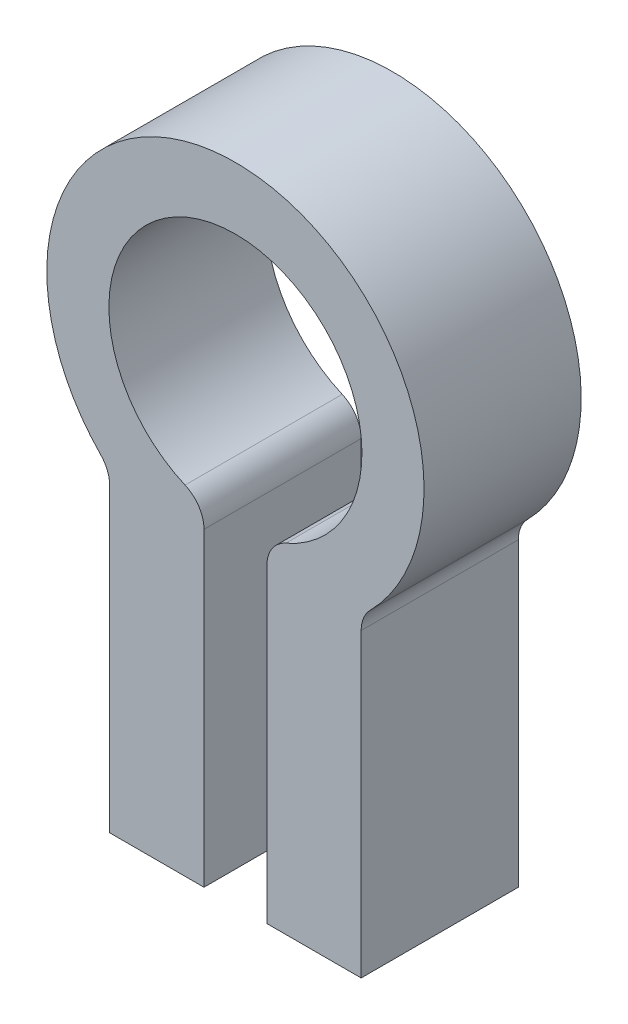
ISO-10303-21;
HEADER;
FILE_DESCRIPTION(('STEP AP214'),'2;1');
FILE_NAME('part.step','',(''),(''),'','','');
FILE_SCHEMA(('AUTOMOTIVE_DESIGN { 1 0 10303 214 1 1 1 1 }'));
ENDSEC;
DATA;
#1=APPLICATION_CONTEXT('core data for automotive mechanical design processes');
#2=APPLICATION_PROTOCOL_DEFINITION('international standard','automotive_design',2000,#1);
#3=PRODUCT_CONTEXT('',#1,'mechanical');
#4=PRODUCT('Part','Part','',(#3));
#5=PRODUCT_RELATED_PRODUCT_CATEGORY('part','',(#4));
#6=PRODUCT_DEFINITION_FORMATION('','',#4);
#7=PRODUCT_DEFINITION_CONTEXT('part definition',#1,'design');
#8=PRODUCT_DEFINITION('design','',#6,#7);
#9=PRODUCT_DEFINITION_SHAPE('','',#8);
#10=(LENGTH_UNIT() NAMED_UNIT(*) SI_UNIT(.MILLI.,.METRE.));
#11=(NAMED_UNIT(*) PLANE_ANGLE_UNIT() SI_UNIT($,.RADIAN.));
#12=(NAMED_UNIT(*) SI_UNIT($,.STERADIAN.) SOLID_ANGLE_UNIT());
#13=UNCERTAINTY_MEASURE_WITH_UNIT(LENGTH_MEASURE(1.E-05),#10,'distance_accuracy_value','');
#14=(GEOMETRIC_REPRESENTATION_CONTEXT(3) GLOBAL_UNCERTAINTY_ASSIGNED_CONTEXT((#13)) GLOBAL_UNIT_ASSIGNED_CONTEXT((#10,
#11,#12)) REPRESENTATION_CONTEXT('',''));
#15=CARTESIAN_POINT('',(0.,0.,0.));
#16=DIRECTION('',(0.,0.,1.));
#17=DIRECTION('',(1.,0.,0.));
#18=AXIS2_PLACEMENT_3D('',#15,#16,#17);
#19=CARTESIAN_POINT('',(0.,0.,5.));
#20=DIRECTION('',(0.,0.,-1.));
#21=DIRECTION('',(-1.,0.,0.));
#22=AXIS2_PLACEMENT_3D('',#19,#20,#21);
#23=CYLINDRICAL_SURFACE('',#22,4.025);
#24=CARTESIAN_POINT('',(0.,0.,0.));
#25=DIRECTION('',(0.,0.,-1.));
#26=DIRECTION('',(1.,0.,0.));
#27=AXIS2_PLACEMENT_3D('',#24,#25,#26);
#28=CIRCLE('',#27,4.025);
#29=CARTESIAN_POINT('',(-1.60199004975124,-3.6924589206243,0.));
#30=VERTEX_POINT('',#29);
#31=CARTESIAN_POINT('',(1.60199004975124,-3.6924589206243,0.));
#32=VERTEX_POINT('',#31);
#33=EDGE_CURVE('E190',#30,#32,#28,.T.);
#34=ORIENTED_EDGE('',*,*,#33,.T.);
#35=DIRECTION('',(0.,0.,-1.));
#36=VECTOR('',#35,1.);
#37=CARTESIAN_POINT('',(1.60199004975124,-3.6924589206243,5.));
#38=LINE('',#37,#36);
#39=CARTESIAN_POINT('',(1.60199004975124,-3.6924589206243,5.));
#40=VERTEX_POINT('',#39);
#41=EDGE_CURVE('E222',#32,#40,#38,.F.);
#42=ORIENTED_EDGE('',*,*,#41,.T.);
#43=CARTESIAN_POINT('',(0.,0.,5.));
#44=DIRECTION('',(0.,0.,-1.));
#45=DIRECTION('',(1.,0.,0.));
#46=AXIS2_PLACEMENT_3D('',#43,#44,#45);
#47=CIRCLE('',#46,4.025);
#48=CARTESIAN_POINT('',(-1.60199004975124,-3.6924589206243,5.));
#49=VERTEX_POINT('',#48);
#50=EDGE_CURVE('E141',#49,#40,#47,.T.);
#51=ORIENTED_EDGE('',*,*,#50,.F.);
#52=DIRECTION('',(0.,0.,-1.));
#53=VECTOR('',#52,1.);
#54=CARTESIAN_POINT('',(-1.60199004975124,-3.69245892062431,5.));
#55=LINE('',#54,#53);
#56=EDGE_CURVE('E219',#49,#30,#55,.T.);
#57=ORIENTED_EDGE('',*,*,#56,.T.);
#58=EDGE_LOOP('',(#34,#42,#51,#57));
#59=FACE_BOUND('',#58,.T.);
#60=ADVANCED_FACE('F37',(#59),#23,.F.);
#61=CARTESIAN_POINT('',(1.,-3.8987978916584,5.));
#62=DIRECTION('',(1.,0.,0.));
#63=DIRECTION('',(0.,1.,0.));
#64=AXIS2_PLACEMENT_3D('',#61,#62,#63);
#65=PLANE('',#64);
#66=DIRECTION('',(0.,-1.,0.));
#67=VECTOR('',#66,1.);
#68=CARTESIAN_POINT('',(1.,-3.8987978916584,5.));
#69=LINE('',#68,#67);
#70=CARTESIAN_POINT('',(1.,-4.60984001891606,5.));
#71=VERTEX_POINT('',#70);
#72=CARTESIAN_POINT('',(1.,-14.4721359549996,5.));
#73=VERTEX_POINT('',#72);
#74=EDGE_CURVE('E127',#71,#73,#69,.T.);
#75=ORIENTED_EDGE('',*,*,#74,.F.);
#76=DIRECTION('',(0.,0.,-1.));
#77=VECTOR('',#76,1.);
#78=CARTESIAN_POINT('',(1.,-4.60984001891606,5.));
#79=LINE('',#78,#77);
#80=CARTESIAN_POINT('',(1.,-4.60984001891606,0.));
#81=VERTEX_POINT('',#80);
#82=EDGE_CURVE('E150',#71,#81,#79,.T.);
#83=ORIENTED_EDGE('',*,*,#82,.T.);
#84=DIRECTION('',(0.,-1.,0.));
#85=VECTOR('',#84,1.);
#86=CARTESIAN_POINT('',(1.,-3.8987978916584,0.));
#87=LINE('',#86,#85);
#88=CARTESIAN_POINT('',(1.,-14.4721359549996,0.));
#89=VERTEX_POINT('',#88);
#90=EDGE_CURVE('E147',#81,#89,#87,.T.);
#91=ORIENTED_EDGE('',*,*,#90,.T.);
#92=DIRECTION('',(0.,0.,-1.));
#93=VECTOR('',#92,1.);
#94=CARTESIAN_POINT('',(1.,-14.4721359549996,5.));
#95=LINE('',#94,#93);
#96=EDGE_CURVE('E144',#73,#89,#95,.T.);
#97=ORIENTED_EDGE('',*,*,#96,.F.);
#98=EDGE_LOOP('',(#75,#83,#91,#97));
#99=FACE_BOUND('',#98,.T.);
#100=ADVANCED_FACE('F145',(#99),#65,.F.);
#101=CARTESIAN_POINT('',(1.,-14.4721359549996,5.));
#102=DIRECTION('',(0.,1.,0.));
#103=DIRECTION('',(-1.,0.,0.));
#104=AXIS2_PLACEMENT_3D('',#101,#102,#103);
#105=PLANE('',#104);
#106=DIRECTION('',(1.,0.,0.));
#107=VECTOR('',#106,1.);
#108=CARTESIAN_POINT('',(1.,-14.4721359549996,0.));
#109=LINE('',#108,#107);
#110=CARTESIAN_POINT('',(4.,-14.4721359549996,0.));
#111=VERTEX_POINT('',#110);
#112=EDGE_CURVE('E194',#89,#111,#109,.T.);
#113=ORIENTED_EDGE('',*,*,#112,.T.);
#114=DIRECTION('',(0.,0.,-1.));
#115=VECTOR('',#114,1.);
#116=CARTESIAN_POINT('',(4.,-14.4721359549996,5.));
#117=LINE('',#116,#115);
#118=CARTESIAN_POINT('',(4.,-14.4721359549996,5.));
#119=VERTEX_POINT('',#118);
#120=EDGE_CURVE('E151',#119,#111,#117,.T.);
#121=ORIENTED_EDGE('',*,*,#120,.F.);
#122=DIRECTION('',(1.,0.,0.));
#123=VECTOR('',#122,1.);
#124=CARTESIAN_POINT('',(1.,-14.4721359549996,5.));
#125=LINE('',#124,#123);
#126=EDGE_CURVE('E133',#73,#119,#125,.T.);
#127=ORIENTED_EDGE('',*,*,#126,.F.);
#128=ORIENTED_EDGE('',*,*,#96,.T.);
#129=EDGE_LOOP('',(#113,#121,#127,#128));
#130=FACE_BOUND('',#129,.T.);
#131=ADVANCED_FACE('F153',(#130),#105,.F.);
#132=CARTESIAN_POINT('',(4.,-14.4721359549996,5.));
#133=DIRECTION('',(-1.,0.,0.));
#134=DIRECTION('',(0.,-1.,0.));
#135=AXIS2_PLACEMENT_3D('',#132,#133,#134);
#136=PLANE('',#135);
#137=DIRECTION('',(0.,1.,0.));
#138=VECTOR('',#137,1.);
#139=CARTESIAN_POINT('',(4.,-14.4721359549996,0.));
#140=LINE('',#139,#138);
#141=CARTESIAN_POINT('',(4.,-4.89897948556635,0.));
#142=VERTEX_POINT('',#141);
#143=EDGE_CURVE('E196',#111,#142,#140,.T.);
#144=ORIENTED_EDGE('',*,*,#143,.T.);
#145=DIRECTION('',(0.,0.,1.));
#146=VECTOR('',#145,1.);
#147=CARTESIAN_POINT('',(4.,-4.89897948556635,5.));
#148=LINE('',#147,#146);
#149=CARTESIAN_POINT('',(4.,-4.89897948556635,5.));
#150=VERTEX_POINT('',#149);
#151=EDGE_CURVE('E248',#142,#150,#148,.T.);
#152=ORIENTED_EDGE('',*,*,#151,.T.);
#153=DIRECTION('',(0.,1.,0.));
#154=VECTOR('',#153,1.);
#155=CARTESIAN_POINT('',(4.,-14.4721359549996,5.));
#156=LINE('',#155,#154);
#157=EDGE_CURVE('E157',#119,#150,#156,.T.);
#158=ORIENTED_EDGE('',*,*,#157,.F.);
#159=ORIENTED_EDGE('',*,*,#120,.T.);
#160=EDGE_LOOP('',(#144,#152,#158,#159));
#161=FACE_BOUND('',#160,.T.);
#162=ADVANCED_FACE('F246',(#161),#136,.F.);
#163=CARTESIAN_POINT('',(0.,0.,5.));
#164=DIRECTION('',(0.,0.,-1.));
#165=DIRECTION('',(-1.,0.,0.));
#166=AXIS2_PLACEMENT_3D('',#163,#164,#165);
#167=CYLINDRICAL_SURFACE('',#166,6.);
#168=CARTESIAN_POINT('',(0.,0.,0.));
#169=DIRECTION('',(0.,0.,1.));
#170=DIRECTION('',(1.,0.,0.));
#171=AXIS2_PLACEMENT_3D('',#168,#169,#170);
#172=CIRCLE('',#171,6.);
#173=CARTESIAN_POINT('',(4.28571428571429,-4.19912527334259,0.));
#174=VERTEX_POINT('',#173);
#175=CARTESIAN_POINT('',(-4.28571428571429,-4.19912527334259,0.));
#176=VERTEX_POINT('',#175);
#177=EDGE_CURVE('E199',#174,#176,#172,.T.);
#178=ORIENTED_EDGE('',*,*,#177,.T.);
#179=DIRECTION('',(0.,0.,-1.));
#180=VECTOR('',#179,1.);
#181=CARTESIAN_POINT('',(-4.28571428571429,-4.19912527334259,5.));
#182=LINE('',#181,#180);
#183=CARTESIAN_POINT('',(-4.28571428571429,-4.19912527334259,5.));
#184=VERTEX_POINT('',#183);
#185=EDGE_CURVE('E257',#176,#184,#182,.F.);
#186=ORIENTED_EDGE('',*,*,#185,.T.);
#187=CARTESIAN_POINT('',(0.,0.,5.));
#188=DIRECTION('',(0.,0.,1.));
#189=DIRECTION('',(1.,0.,0.));
#190=AXIS2_PLACEMENT_3D('',#187,#188,#189);
#191=CIRCLE('',#190,6.);
#192=CARTESIAN_POINT('',(4.28571428571429,-4.19912527334259,5.));
#193=VERTEX_POINT('',#192);
#194=EDGE_CURVE('E160',#193,#184,#191,.T.);
#195=ORIENTED_EDGE('',*,*,#194,.F.);
#196=DIRECTION('',(0.,0.,-1.));
#197=VECTOR('',#196,1.);
#198=CARTESIAN_POINT('',(4.28571428571429,-4.19912527334259,5.));
#199=LINE('',#198,#197);
#200=EDGE_CURVE('E254',#193,#174,#199,.T.);
#201=ORIENTED_EDGE('',*,*,#200,.T.);
#202=EDGE_LOOP('',(#178,#186,#195,#201));
#203=FACE_BOUND('',#202,.T.);
#204=ADVANCED_FACE('F269',(#203),#167,.T.);
#205=CARTESIAN_POINT('',(-4.,-14.4721359549996,5.));
#206=DIRECTION('',(1.,0.,0.));
#207=DIRECTION('',(0.,1.,0.));
#208=AXIS2_PLACEMENT_3D('',#205,#206,#207);
#209=PLANE('',#208);
#210=DIRECTION('',(0.,-1.,0.));
#211=VECTOR('',#210,1.);
#212=CARTESIAN_POINT('',(-4.,-14.4721359549996,5.));
#213=LINE('',#212,#211);
#214=CARTESIAN_POINT('',(-4.,-4.89897948556636,5.));
#215=VERTEX_POINT('',#214);
#216=CARTESIAN_POINT('',(-4.,-14.4721359549996,5.));
#217=VERTEX_POINT('',#216);
#218=EDGE_CURVE('E177',#215,#217,#213,.T.);
#219=ORIENTED_EDGE('',*,*,#218,.F.);
#220=DIRECTION('',(0.,0.,1.));
#221=VECTOR('',#220,1.);
#222=CARTESIAN_POINT('',(-4.,-4.89897948556636,0.));
#223=LINE('',#222,#221);
#224=CARTESIAN_POINT('',(-4.,-4.89897948556636,0.));
#225=VERTEX_POINT('',#224);
#226=EDGE_CURVE('E258',#215,#225,#223,.F.);
#227=ORIENTED_EDGE('',*,*,#226,.T.);
#228=DIRECTION('',(0.,-1.,0.));
#229=VECTOR('',#228,1.);
#230=CARTESIAN_POINT('',(-4.,-14.4721359549996,0.));
#231=LINE('',#230,#229);
#232=CARTESIAN_POINT('',(-4.,-14.4721359549996,0.));
#233=VERTEX_POINT('',#232);
#234=EDGE_CURVE('E202',#225,#233,#231,.T.);
#235=ORIENTED_EDGE('',*,*,#234,.T.);
#236=DIRECTION('',(0.,0.,-1.));
#237=VECTOR('',#236,1.);
#238=CARTESIAN_POINT('',(-4.,-14.4721359549996,5.));
#239=LINE('',#238,#237);
#240=EDGE_CURVE('E210',#217,#233,#239,.T.);
#241=ORIENTED_EDGE('',*,*,#240,.F.);
#242=EDGE_LOOP('',(#219,#227,#235,#241));
#243=FACE_BOUND('',#242,.T.);
#244=ADVANCED_FACE('F274',(#243),#209,.F.);
#245=CARTESIAN_POINT('',(-0.999999999999998,-14.4721359549996,5.));
#246=DIRECTION('',(0.,1.,0.));
#247=DIRECTION('',(0.,0.,1.));
#248=AXIS2_PLACEMENT_3D('',#245,#246,#247);
#249=PLANE('',#248);
#250=DIRECTION('',(1.,0.,0.));
#251=VECTOR('',#250,1.);
#252=CARTESIAN_POINT('',(-0.999999999999998,-14.4721359549996,0.));
#253=LINE('',#252,#251);
#254=CARTESIAN_POINT('',(-0.999999999999998,-14.4721359549996,0.));
#255=VERTEX_POINT('',#254);
#256=EDGE_CURVE('E204',#233,#255,#253,.T.);
#257=ORIENTED_EDGE('',*,*,#256,.T.);
#258=DIRECTION('',(0.,0.,-1.));
#259=VECTOR('',#258,1.);
#260=CARTESIAN_POINT('',(-0.999999999999998,-14.4721359549996,5.));
#261=LINE('',#260,#259);
#262=CARTESIAN_POINT('',(-0.999999999999998,-14.4721359549996,5.));
#263=VERTEX_POINT('',#262);
#264=EDGE_CURVE('E189',#263,#255,#261,.T.);
#265=ORIENTED_EDGE('',*,*,#264,.F.);
#266=DIRECTION('',(1.,0.,0.));
#267=VECTOR('',#266,1.);
#268=CARTESIAN_POINT('',(-0.999999999999998,-14.4721359549996,5.));
#269=LINE('',#268,#267);
#270=EDGE_CURVE('E181',#217,#263,#269,.T.);
#271=ORIENTED_EDGE('',*,*,#270,.F.);
#272=ORIENTED_EDGE('',*,*,#240,.T.);
#273=EDGE_LOOP('',(#257,#265,#271,#272));
#274=FACE_BOUND('',#273,.T.);
#275=ADVANCED_FACE('F280',(#274),#249,.F.);
#276=CARTESIAN_POINT('',(-1.,-3.8987978916584,5.));
#277=DIRECTION('',(-1.,0.,0.));
#278=DIRECTION('',(0.,-1.,0.));
#279=AXIS2_PLACEMENT_3D('',#276,#277,#278);
#280=PLANE('',#279);
#281=DIRECTION('',(0.,1.,0.));
#282=VECTOR('',#281,1.);
#283=CARTESIAN_POINT('',(-1.,-3.8987978916584,0.));
#284=LINE('',#283,#282);
#285=CARTESIAN_POINT('',(-1.,-4.60984001891606,0.));
#286=VERTEX_POINT('',#285);
#287=EDGE_CURVE('E206',#255,#286,#284,.T.);
#288=ORIENTED_EDGE('',*,*,#287,.T.);
#289=DIRECTION('',(0.,0.,-1.));
#290=VECTOR('',#289,1.);
#291=CARTESIAN_POINT('',(-1.,-4.60984001891606,5.));
#292=LINE('',#291,#290);
#293=CARTESIAN_POINT('',(-1.,-4.60984001891606,5.));
#294=VERTEX_POINT('',#293);
#295=EDGE_CURVE('E53',#286,#294,#292,.F.);
#296=ORIENTED_EDGE('',*,*,#295,.T.);
#297=DIRECTION('',(0.,1.,0.));
#298=VECTOR('',#297,1.);
#299=CARTESIAN_POINT('',(-1.,-3.8987978916584,5.));
#300=LINE('',#299,#298);
#301=EDGE_CURVE('E185',#263,#294,#300,.T.);
#302=ORIENTED_EDGE('',*,*,#301,.F.);
#303=ORIENTED_EDGE('',*,*,#264,.T.);
#304=EDGE_LOOP('',(#288,#296,#302,#303));
#305=FACE_BOUND('',#304,.T.);
#306=ADVANCED_FACE('F282',(#305),#280,.F.);
#307=CARTESIAN_POINT('',(0.,0.,5.));
#308=DIRECTION('',(0.,0.,1.));
#309=DIRECTION('',(1.,0.,0.));
#310=AXIS2_PLACEMENT_3D('',#307,#308,#309);
#311=PLANE('',#310);
#312=ORIENTED_EDGE('',*,*,#50,.T.);
#313=CARTESIAN_POINT('',(2.,-4.60984001891606,5.));
#314=DIRECTION('',(0.,0.,1.));
#315=DIRECTION('',(1.,0.,0.));
#316=AXIS2_PLACEMENT_3D('',#313,#314,#315);
#317=CIRCLE('',#316,1.);
#318=EDGE_CURVE('E136',#40,#71,#317,.T.);
#319=ORIENTED_EDGE('',*,*,#318,.T.);
#320=ORIENTED_EDGE('',*,*,#74,.T.);
#321=ORIENTED_EDGE('',*,*,#126,.T.);
#322=ORIENTED_EDGE('',*,*,#157,.T.);
#323=CARTESIAN_POINT('',(5.,-4.89897948556635,5.));
#324=DIRECTION('',(0.,0.,1.));
#325=DIRECTION('',(1.,0.,0.));
#326=AXIS2_PLACEMENT_3D('',#323,#324,#325);
#327=CIRCLE('',#326,1.);
#328=EDGE_CURVE('E12',#150,#193,#327,.F.);
#329=ORIENTED_EDGE('',*,*,#328,.T.);
#330=ORIENTED_EDGE('',*,*,#194,.T.);
#331=CARTESIAN_POINT('',(-5.,-4.89897948556636,5.));
#332=DIRECTION('',(0.,0.,1.));
#333=DIRECTION('',(1.,0.,0.));
#334=AXIS2_PLACEMENT_3D('',#331,#332,#333);
#335=CIRCLE('',#334,1.);
#336=EDGE_CURVE('E61',#184,#215,#335,.F.);
#337=ORIENTED_EDGE('',*,*,#336,.T.);
#338=ORIENTED_EDGE('',*,*,#218,.T.);
#339=ORIENTED_EDGE('',*,*,#270,.T.);
#340=ORIENTED_EDGE('',*,*,#301,.T.);
#341=CARTESIAN_POINT('',(-2.,-4.60984001891606,5.));
#342=DIRECTION('',(0.,0.,1.));
#343=DIRECTION('',(1.,0.,0.));
#344=AXIS2_PLACEMENT_3D('',#341,#342,#343);
#345=CIRCLE('',#344,1.);
#346=EDGE_CURVE('E223',#294,#49,#345,.T.);
#347=ORIENTED_EDGE('',*,*,#346,.T.);
#348=EDGE_LOOP('',(#312,#319,#320,#321,#322,#329,#330,#337,#338,#339,#340,#347));
#349=FACE_BOUND('',#348,.T.);
#350=ADVANCED_FACE('F130',(#349),#311,.T.);
#351=CARTESIAN_POINT('',(0.,0.,0.));
#352=DIRECTION('',(0.,0.,1.));
#353=DIRECTION('',(1.,0.,0.));
#354=AXIS2_PLACEMENT_3D('',#351,#352,#353);
#355=PLANE('',#354);
#356=ORIENTED_EDGE('',*,*,#90,.F.);
#357=CARTESIAN_POINT('',(2.,-4.60984001891606,0.));
#358=DIRECTION('',(0.,0.,1.));
#359=DIRECTION('',(1.,0.,0.));
#360=AXIS2_PLACEMENT_3D('',#357,#358,#359);
#361=CIRCLE('',#360,1.);
#362=EDGE_CURVE('E217',#81,#32,#361,.F.);
#363=ORIENTED_EDGE('',*,*,#362,.T.);
#364=ORIENTED_EDGE('',*,*,#33,.F.);
#365=CARTESIAN_POINT('',(-2.,-4.60984001891606,0.));
#366=DIRECTION('',(0.,0.,1.));
#367=DIRECTION('',(1.,0.,0.));
#368=AXIS2_PLACEMENT_3D('',#365,#366,#367);
#369=CIRCLE('',#368,1.);
#370=EDGE_CURVE('E215',#30,#286,#369,.F.);
#371=ORIENTED_EDGE('',*,*,#370,.T.);
#372=ORIENTED_EDGE('',*,*,#287,.F.);
#373=ORIENTED_EDGE('',*,*,#256,.F.);
#374=ORIENTED_EDGE('',*,*,#234,.F.);
#375=CARTESIAN_POINT('',(-5.,-4.89897948556636,0.));
#376=DIRECTION('',(0.,0.,1.));
#377=DIRECTION('',(1.,0.,0.));
#378=AXIS2_PLACEMENT_3D('',#375,#376,#377);
#379=CIRCLE('',#378,1.);
#380=EDGE_CURVE('E264',#225,#176,#379,.T.);
#381=ORIENTED_EDGE('',*,*,#380,.T.);
#382=ORIENTED_EDGE('',*,*,#177,.F.);
#383=CARTESIAN_POINT('',(5.,-4.89897948556635,0.));
#384=DIRECTION('',(0.,0.,1.));
#385=DIRECTION('',(1.,0.,0.));
#386=AXIS2_PLACEMENT_3D('',#383,#384,#385);
#387=CIRCLE('',#386,1.);
#388=EDGE_CURVE('E46',#174,#142,#387,.T.);
#389=ORIENTED_EDGE('',*,*,#388,.T.);
#390=ORIENTED_EDGE('',*,*,#143,.F.);
#391=ORIENTED_EDGE('',*,*,#112,.F.);
#392=EDGE_LOOP('',(#356,#363,#364,#371,#372,#373,#374,#381,#382,#389,#390,#391));
#393=FACE_BOUND('',#392,.T.);
#394=ADVANCED_FACE('F242',(#393),#355,.F.);
#395=CARTESIAN_POINT('',(2.,-4.60984001891606,5.));
#396=DIRECTION('',(0.,0.,-1.));
#397=DIRECTION('',(-1.,0.,0.));
#398=AXIS2_PLACEMENT_3D('',#395,#396,#397);
#399=CYLINDRICAL_SURFACE('',#398,1.);
#400=ORIENTED_EDGE('',*,*,#318,.F.);
#401=ORIENTED_EDGE('',*,*,#41,.F.);
#402=ORIENTED_EDGE('',*,*,#362,.F.);
#403=ORIENTED_EDGE('',*,*,#82,.F.);
#404=EDGE_LOOP('',(#400,#401,#402,#403));
#405=FACE_BOUND('',#404,.T.);
#406=ADVANCED_FACE('F240',(#405),#399,.T.);
#407=CARTESIAN_POINT('',(-2.,-4.60984001891606,5.));
#408=DIRECTION('',(0.,0.,-1.));
#409=DIRECTION('',(-1.,0.,0.));
#410=AXIS2_PLACEMENT_3D('',#407,#408,#409);
#411=CYLINDRICAL_SURFACE('',#410,1.);
#412=ORIENTED_EDGE('',*,*,#346,.F.);
#413=ORIENTED_EDGE('',*,*,#295,.F.);
#414=ORIENTED_EDGE('',*,*,#370,.F.);
#415=ORIENTED_EDGE('',*,*,#56,.F.);
#416=EDGE_LOOP('',(#412,#413,#414,#415));
#417=FACE_BOUND('',#416,.T.);
#418=ADVANCED_FACE('F284',(#417),#411,.T.);
#419=CARTESIAN_POINT('',(-5.,-4.89897948556636,5.));
#420=DIRECTION('',(0.,0.,-1.));
#421=DIRECTION('',(-1.,0.,0.));
#422=AXIS2_PLACEMENT_3D('',#419,#420,#421);
#423=CYLINDRICAL_SURFACE('',#422,1.);
#424=ORIENTED_EDGE('',*,*,#336,.F.);
#425=ORIENTED_EDGE('',*,*,#185,.F.);
#426=ORIENTED_EDGE('',*,*,#380,.F.);
#427=ORIENTED_EDGE('',*,*,#226,.F.);
#428=EDGE_LOOP('',(#424,#425,#426,#427));
#429=FACE_BOUND('',#428,.T.);
#430=ADVANCED_FACE('F271',(#429),#423,.F.);
#431=CARTESIAN_POINT('',(5.,-4.89897948556635,5.));
#432=DIRECTION('',(0.,0.,-1.));
#433=DIRECTION('',(-1.,0.,0.));
#434=AXIS2_PLACEMENT_3D('',#431,#432,#433);
#435=CYLINDRICAL_SURFACE('',#434,1.);
#436=ORIENTED_EDGE('',*,*,#328,.F.);
#437=ORIENTED_EDGE('',*,*,#151,.F.);
#438=ORIENTED_EDGE('',*,*,#388,.F.);
#439=ORIENTED_EDGE('',*,*,#200,.F.);
#440=EDGE_LOOP('',(#436,#437,#438,#439));
#441=FACE_BOUND('',#440,.T.);
#442=ADVANCED_FACE('F39',(#441),#435,.F.);
#443=CLOSED_SHELL('',(#60,#100,#131,#162,#204,#244,#275,#306,#350,#394,#406,#418,#430,#442));
#444=MANIFOLD_SOLID_BREP('B2',#443);
#445=ADVANCED_BREP_SHAPE_REPRESENTATION('',(#18,#444),#14);
#446=SHAPE_DEFINITION_REPRESENTATION(#9,#445);
ENDSEC;
END-ISO-10303-21;
